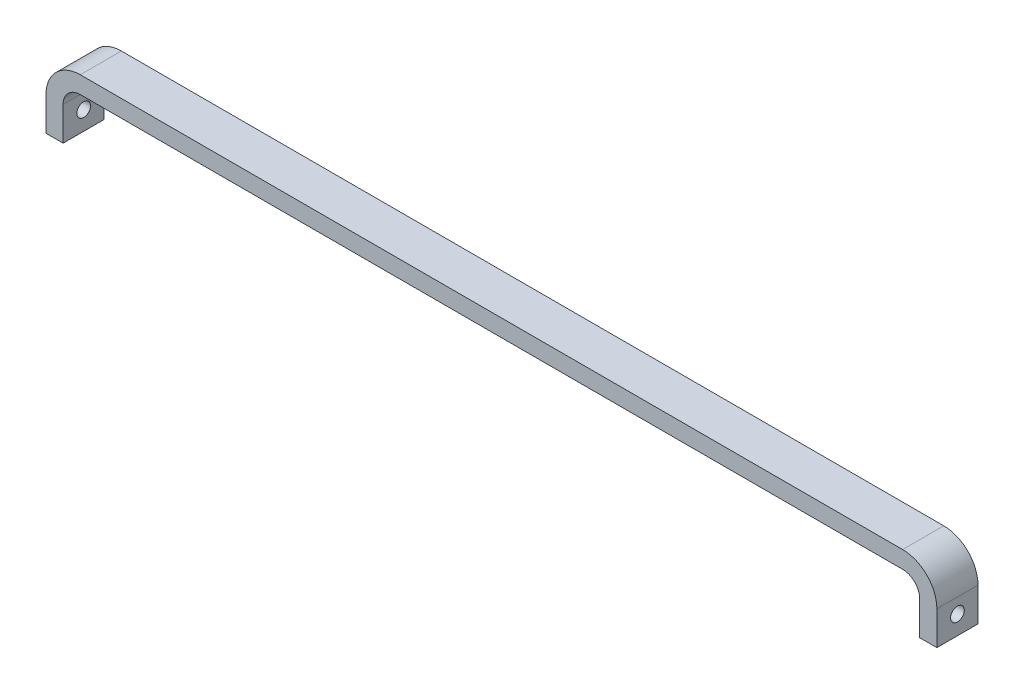
ISO-10303-21;
HEADER;
FILE_DESCRIPTION(('STEP AP214'),'2;1');
FILE_NAME('part.step','',(''),(''),'','','');
FILE_SCHEMA(('AUTOMOTIVE_DESIGN { 1 0 10303 214 1 1 1 1 }'));
ENDSEC;
DATA;
#1=APPLICATION_CONTEXT('core data for automotive mechanical design processes');
#2=APPLICATION_PROTOCOL_DEFINITION('international standard','automotive_design',2000,#1);
#3=PRODUCT_CONTEXT('',#1,'mechanical');
#4=PRODUCT('Part','Part','',(#3));
#5=PRODUCT_RELATED_PRODUCT_CATEGORY('part','',(#4));
#6=PRODUCT_DEFINITION_FORMATION('','',#4);
#7=PRODUCT_DEFINITION_CONTEXT('part definition',#1,'design');
#8=PRODUCT_DEFINITION('design','',#6,#7);
#9=PRODUCT_DEFINITION_SHAPE('','',#8);
#10=(LENGTH_UNIT() NAMED_UNIT(*) SI_UNIT(.MILLI.,.METRE.));
#11=(NAMED_UNIT(*) PLANE_ANGLE_UNIT() SI_UNIT($,.RADIAN.));
#12=(NAMED_UNIT(*) SI_UNIT($,.STERADIAN.) SOLID_ANGLE_UNIT());
#13=UNCERTAINTY_MEASURE_WITH_UNIT(LENGTH_MEASURE(1.E-05),#10,'distance_accuracy_value','');
#14=(GEOMETRIC_REPRESENTATION_CONTEXT(3) GLOBAL_UNCERTAINTY_ASSIGNED_CONTEXT((#13)) GLOBAL_UNIT_ASSIGNED_CONTEXT((#10,
#11,#12)) REPRESENTATION_CONTEXT('',''));
#15=CARTESIAN_POINT('',(0.,0.,0.));
#16=DIRECTION('',(0.,0.,1.));
#17=DIRECTION('',(1.,0.,0.));
#18=AXIS2_PLACEMENT_3D('',#15,#16,#17);
#19=CARTESIAN_POINT('',(0.,29.6,24.));
#20=DIRECTION('',(0.,1.,0.));
#21=DIRECTION('',(0.,0.,1.));
#22=AXIS2_PLACEMENT_3D('',#19,#20,#21);
#23=PLANE('',#22);
#24=DIRECTION('',(1.,0.,0.));
#25=VECTOR('',#24,1.);
#26=CARTESIAN_POINT('',(0.,29.6,0.));
#27=LINE('',#26,#25);
#28=CARTESIAN_POINT('',(20.,29.6,0.));
#29=VERTEX_POINT('',#28);
#30=CARTESIAN_POINT('',(500.,29.6,0.));
#31=VERTEX_POINT('',#30);
#32=EDGE_CURVE('E173',#29,#31,#27,.T.);
#33=ORIENTED_EDGE('',*,*,#32,.T.);
#34=DIRECTION('',(0.,0.,-1.));
#35=VECTOR('',#34,1.);
#36=CARTESIAN_POINT('',(500.,29.6,24.));
#37=LINE('',#36,#35);
#38=CARTESIAN_POINT('',(500.,29.6,24.));
#39=VERTEX_POINT('',#38);
#40=EDGE_CURVE('E11',#39,#31,#37,.T.);
#41=ORIENTED_EDGE('',*,*,#40,.F.);
#42=DIRECTION('',(1.,0.,0.));
#43=VECTOR('',#42,1.);
#44=CARTESIAN_POINT('',(0.,29.6,24.));
#45=LINE('',#44,#43);
#46=CARTESIAN_POINT('',(20.,29.6,24.));
#47=VERTEX_POINT('',#46);
#48=EDGE_CURVE('E215',#47,#39,#45,.T.);
#49=ORIENTED_EDGE('',*,*,#48,.F.);
#50=DIRECTION('',(0.,0.,-1.));
#51=VECTOR('',#50,1.);
#52=CARTESIAN_POINT('',(20.,29.6,24.));
#53=LINE('',#52,#51);
#54=EDGE_CURVE('E65',#47,#29,#53,.T.);
#55=ORIENTED_EDGE('',*,*,#54,.T.);
#56=EDGE_LOOP('',(#33,#41,#49,#55));
#57=FACE_BOUND('',#56,.T.);
#58=ADVANCED_FACE('F47',(#57),#23,.F.);
#59=CARTESIAN_POINT('',(500.,19.6,24.));
#60=DIRECTION('',(0.,0.,-1.));
#61=DIRECTION('',(-1.,0.,0.));
#62=AXIS2_PLACEMENT_3D('',#59,#60,#61);
#63=CYLINDRICAL_SURFACE('',#62,10.);
#64=CARTESIAN_POINT('',(500.,19.6,0.));
#65=DIRECTION('',(0.,0.,1.));
#66=DIRECTION('',(1.,0.,0.));
#67=AXIS2_PLACEMENT_3D('',#64,#65,#66);
#68=CIRCLE('',#67,10.);
#69=CARTESIAN_POINT('',(510.,19.6,0.));
#70=VERTEX_POINT('',#69);
#71=EDGE_CURVE('E176',#31,#70,#68,.F.);
#72=ORIENTED_EDGE('',*,*,#71,.T.);
#73=DIRECTION('',(0.,0.,-1.));
#74=VECTOR('',#73,1.);
#75=CARTESIAN_POINT('',(510.,19.6,24.));
#76=LINE('',#75,#74);
#77=CARTESIAN_POINT('',(510.,19.6,24.));
#78=VERTEX_POINT('',#77);
#79=EDGE_CURVE('E57',#78,#70,#76,.T.);
#80=ORIENTED_EDGE('',*,*,#79,.F.);
#81=CARTESIAN_POINT('',(500.,19.6,24.));
#82=DIRECTION('',(0.,0.,1.));
#83=DIRECTION('',(1.,0.,0.));
#84=AXIS2_PLACEMENT_3D('',#81,#82,#83);
#85=CIRCLE('',#84,10.);
#86=EDGE_CURVE('E115',#39,#78,#85,.F.);
#87=ORIENTED_EDGE('',*,*,#86,.F.);
#88=ORIENTED_EDGE('',*,*,#40,.T.);
#89=EDGE_LOOP('',(#72,#80,#87,#88));
#90=FACE_BOUND('',#89,.T.);
#91=ADVANCED_FACE('F300',(#90),#63,.F.);
#92=CARTESIAN_POINT('',(510.,0.,24.));
#93=DIRECTION('',(1.,0.,0.));
#94=DIRECTION('',(0.,0.,-1.));
#95=AXIS2_PLACEMENT_3D('',#92,#93,#94);
#96=PLANE('',#95);
#97=CARTESIAN_POINT('',(510.,11.,12.));
#98=DIRECTION('',(1.,0.,0.));
#99=DIRECTION('',(0.,0.,-1.));
#100=AXIS2_PLACEMENT_3D('',#97,#98,#99);
#101=CIRCLE('',#100,4.);
#102=CARTESIAN_POINT('',(510.,11.,8.));
#103=VERTEX_POINT('',#102);
#104=EDGE_CURVE('E177',#103,#103,#101,.T.);
#105=ORIENTED_EDGE('',*,*,#104,.T.);
#106=EDGE_LOOP('',(#105));
#107=FACE_BOUND('',#106,.T.);
#108=DIRECTION('',(0.,-1.,0.));
#109=VECTOR('',#108,1.);
#110=CARTESIAN_POINT('',(510.,0.,0.));
#111=LINE('',#110,#109);
#112=CARTESIAN_POINT('',(510.,0.,0.));
#113=VERTEX_POINT('',#112);
#114=EDGE_CURVE('E180',#70,#113,#111,.T.);
#115=ORIENTED_EDGE('',*,*,#114,.T.);
#116=DIRECTION('',(0.,0.,-1.));
#117=VECTOR('',#116,1.);
#118=CARTESIAN_POINT('',(510.,0.,24.));
#119=LINE('',#118,#117);
#120=CARTESIAN_POINT('',(510.,0.,24.));
#121=VERTEX_POINT('',#120);
#122=EDGE_CURVE('E238',#121,#113,#119,.T.);
#123=ORIENTED_EDGE('',*,*,#122,.F.);
#124=DIRECTION('',(0.,-1.,0.));
#125=VECTOR('',#124,1.);
#126=CARTESIAN_POINT('',(510.,0.,24.));
#127=LINE('',#126,#125);
#128=EDGE_CURVE('E249',#78,#121,#127,.T.);
#129=ORIENTED_EDGE('',*,*,#128,.F.);
#130=ORIENTED_EDGE('',*,*,#79,.T.);
#131=EDGE_LOOP('',(#115,#123,#129,#130));
#132=FACE_BOUND('',#131,.T.);
#133=ADVANCED_FACE('F247',(#107,#132),#96,.F.);
#134=CARTESIAN_POINT('',(0.,0.,24.));
#135=DIRECTION('',(0.,1.,0.));
#136=DIRECTION('',(0.,0.,1.));
#137=AXIS2_PLACEMENT_3D('',#134,#135,#136);
#138=PLANE('',#137);
#139=DIRECTION('',(1.,0.,0.));
#140=VECTOR('',#139,1.);
#141=CARTESIAN_POINT('',(0.,0.,0.));
#142=LINE('',#141,#140);
#143=CARTESIAN_POINT('',(520.,0.,0.));
#144=VERTEX_POINT('',#143);
#145=EDGE_CURVE('E183',#113,#144,#142,.T.);
#146=ORIENTED_EDGE('',*,*,#145,.T.);
#147=DIRECTION('',(0.,0.,-1.));
#148=VECTOR('',#147,1.);
#149=CARTESIAN_POINT('',(520.,0.,24.));
#150=LINE('',#149,#148);
#151=CARTESIAN_POINT('',(520.,0.,24.));
#152=VERTEX_POINT('',#151);
#153=EDGE_CURVE('E234',#152,#144,#150,.T.);
#154=ORIENTED_EDGE('',*,*,#153,.F.);
#155=DIRECTION('',(1.,0.,0.));
#156=VECTOR('',#155,1.);
#157=CARTESIAN_POINT('',(0.,0.,24.));
#158=LINE('',#157,#156);
#159=EDGE_CURVE('E267',#121,#152,#158,.T.);
#160=ORIENTED_EDGE('',*,*,#159,.F.);
#161=ORIENTED_EDGE('',*,*,#122,.T.);
#162=EDGE_LOOP('',(#146,#154,#160,#161));
#163=FACE_BOUND('',#162,.T.);
#164=ADVANCED_FACE('F256',(#163),#138,.F.);
#165=CARTESIAN_POINT('',(520.,0.,24.));
#166=DIRECTION('',(-1.,0.,0.));
#167=DIRECTION('',(0.,0.,1.));
#168=AXIS2_PLACEMENT_3D('',#165,#166,#167);
#169=PLANE('',#168);
#170=CARTESIAN_POINT('',(520.,11.,12.));
#171=DIRECTION('',(-1.,0.,0.));
#172=DIRECTION('',(0.,0.,1.));
#173=AXIS2_PLACEMENT_3D('',#170,#171,#172);
#174=CIRCLE('',#173,4.);
#175=CARTESIAN_POINT('',(520.,11.,16.));
#176=VERTEX_POINT('',#175);
#177=EDGE_CURVE('E318',#176,#176,#174,.T.);
#178=ORIENTED_EDGE('',*,*,#177,.T.);
#179=EDGE_LOOP('',(#178));
#180=FACE_BOUND('',#179,.T.);
#181=DIRECTION('',(0.,1.,0.));
#182=VECTOR('',#181,1.);
#183=CARTESIAN_POINT('',(520.,0.,0.));
#184=LINE('',#183,#182);
#185=CARTESIAN_POINT('',(520.,19.6,0.));
#186=VERTEX_POINT('',#185);
#187=EDGE_CURVE('E186',#144,#186,#184,.T.);
#188=ORIENTED_EDGE('',*,*,#187,.T.);
#189=DIRECTION('',(0.,0.,-1.));
#190=VECTOR('',#189,1.);
#191=CARTESIAN_POINT('',(520.,19.6,24.));
#192=LINE('',#191,#190);
#193=CARTESIAN_POINT('',(520.,19.6,24.));
#194=VERTEX_POINT('',#193);
#195=EDGE_CURVE('E231',#194,#186,#192,.T.);
#196=ORIENTED_EDGE('',*,*,#195,.F.);
#197=DIRECTION('',(0.,1.,0.));
#198=VECTOR('',#197,1.);
#199=CARTESIAN_POINT('',(520.,0.,24.));
#200=LINE('',#199,#198);
#201=EDGE_CURVE('E262',#152,#194,#200,.T.);
#202=ORIENTED_EDGE('',*,*,#201,.F.);
#203=ORIENTED_EDGE('',*,*,#153,.T.);
#204=EDGE_LOOP('',(#188,#196,#202,#203));
#205=FACE_BOUND('',#204,.T.);
#206=ADVANCED_FACE('F260',(#180,#205),#169,.F.);
#207=CARTESIAN_POINT('',(500.,19.6,24.));
#208=DIRECTION('',(0.,0.,-1.));
#209=DIRECTION('',(-1.,0.,0.));
#210=AXIS2_PLACEMENT_3D('',#207,#208,#209);
#211=CYLINDRICAL_SURFACE('',#210,20.);
#212=CARTESIAN_POINT('',(500.,19.6,0.));
#213=DIRECTION('',(0.,0.,1.));
#214=DIRECTION('',(1.,0.,0.));
#215=AXIS2_PLACEMENT_3D('',#212,#213,#214);
#216=CIRCLE('',#215,20.);
#217=CARTESIAN_POINT('',(500.,39.6,0.));
#218=VERTEX_POINT('',#217);
#219=EDGE_CURVE('E190',#218,#186,#216,.F.);
#220=ORIENTED_EDGE('',*,*,#219,.F.);
#221=DIRECTION('',(0.,0.,-1.));
#222=VECTOR('',#221,1.);
#223=CARTESIAN_POINT('',(500.,39.6,24.));
#224=LINE('',#223,#222);
#225=CARTESIAN_POINT('',(500.,39.6,24.));
#226=VERTEX_POINT('',#225);
#227=EDGE_CURVE('E228',#226,#218,#224,.T.);
#228=ORIENTED_EDGE('',*,*,#227,.F.);
#229=CARTESIAN_POINT('',(500.,19.6,24.));
#230=DIRECTION('',(0.,0.,1.));
#231=DIRECTION('',(1.,0.,0.));
#232=AXIS2_PLACEMENT_3D('',#229,#230,#231);
#233=CIRCLE('',#232,20.);
#234=EDGE_CURVE('E266',#226,#194,#233,.F.);
#235=ORIENTED_EDGE('',*,*,#234,.T.);
#236=ORIENTED_EDGE('',*,*,#195,.T.);
#237=EDGE_LOOP('',(#220,#228,#235,#236));
#238=FACE_BOUND('',#237,.T.);
#239=ADVANCED_FACE('F348',(#238),#211,.T.);
#240=CARTESIAN_POINT('',(0.,39.6,24.));
#241=DIRECTION('',(0.,1.,0.));
#242=DIRECTION('',(0.,0.,1.));
#243=AXIS2_PLACEMENT_3D('',#240,#241,#242);
#244=PLANE('',#243);
#245=DIRECTION('',(1.,0.,0.));
#246=VECTOR('',#245,1.);
#247=CARTESIAN_POINT('',(0.,39.6,0.));
#248=LINE('',#247,#246);
#249=CARTESIAN_POINT('',(20.,39.6,0.));
#250=VERTEX_POINT('',#249);
#251=EDGE_CURVE('E194',#250,#218,#248,.T.);
#252=ORIENTED_EDGE('',*,*,#251,.F.);
#253=DIRECTION('',(0.,0.,-1.));
#254=VECTOR('',#253,1.);
#255=CARTESIAN_POINT('',(20.,39.6,24.));
#256=LINE('',#255,#254);
#257=CARTESIAN_POINT('',(20.,39.6,24.));
#258=VERTEX_POINT('',#257);
#259=EDGE_CURVE('E225',#258,#250,#256,.T.);
#260=ORIENTED_EDGE('',*,*,#259,.F.);
#261=DIRECTION('',(1.,0.,0.));
#262=VECTOR('',#261,1.);
#263=CARTESIAN_POINT('',(0.,39.6,24.));
#264=LINE('',#263,#262);
#265=EDGE_CURVE('E271',#258,#226,#264,.T.);
#266=ORIENTED_EDGE('',*,*,#265,.T.);
#267=ORIENTED_EDGE('',*,*,#227,.T.);
#268=EDGE_LOOP('',(#252,#260,#266,#267));
#269=FACE_BOUND('',#268,.T.);
#270=ADVANCED_FACE('F342',(#269),#244,.T.);
#271=CARTESIAN_POINT('',(20.,19.6,24.));
#272=DIRECTION('',(0.,0.,-1.));
#273=DIRECTION('',(-1.,0.,0.));
#274=AXIS2_PLACEMENT_3D('',#271,#272,#273);
#275=CYLINDRICAL_SURFACE('',#274,20.);
#276=CARTESIAN_POINT('',(20.,19.6,0.));
#277=DIRECTION('',(0.,0.,1.));
#278=DIRECTION('',(1.,0.,0.));
#279=AXIS2_PLACEMENT_3D('',#276,#277,#278);
#280=CIRCLE('',#279,20.);
#281=CARTESIAN_POINT('',(0.,19.6,0.));
#282=VERTEX_POINT('',#281);
#283=EDGE_CURVE('E198',#250,#282,#280,.T.);
#284=ORIENTED_EDGE('',*,*,#283,.T.);
#285=DIRECTION('',(0.,0.,-1.));
#286=VECTOR('',#285,1.);
#287=CARTESIAN_POINT('',(0.,19.6,24.));
#288=LINE('',#287,#286);
#289=CARTESIAN_POINT('',(0.,19.6,24.));
#290=VERTEX_POINT('',#289);
#291=EDGE_CURVE('E222',#290,#282,#288,.T.);
#292=ORIENTED_EDGE('',*,*,#291,.F.);
#293=CARTESIAN_POINT('',(20.,19.6,24.));
#294=DIRECTION('',(0.,0.,1.));
#295=DIRECTION('',(1.,0.,0.));
#296=AXIS2_PLACEMENT_3D('',#293,#294,#295);
#297=CIRCLE('',#296,20.);
#298=EDGE_CURVE('E279',#258,#290,#297,.T.);
#299=ORIENTED_EDGE('',*,*,#298,.F.);
#300=ORIENTED_EDGE('',*,*,#259,.T.);
#301=EDGE_LOOP('',(#284,#292,#299,#300));
#302=FACE_BOUND('',#301,.T.);
#303=ADVANCED_FACE('F335',(#302),#275,.T.);
#304=CARTESIAN_POINT('',(0.,0.,24.));
#305=DIRECTION('',(-1.,0.,0.));
#306=DIRECTION('',(0.,0.,1.));
#307=AXIS2_PLACEMENT_3D('',#304,#305,#306);
#308=PLANE('',#307);
#309=CARTESIAN_POINT('',(0.,11.,12.));
#310=DIRECTION('',(-1.,0.,0.));
#311=DIRECTION('',(0.,0.,1.));
#312=AXIS2_PLACEMENT_3D('',#309,#310,#311);
#313=CIRCLE('',#312,4.);
#314=CARTESIAN_POINT('',(0.,11.,16.));
#315=VERTEX_POINT('',#314);
#316=EDGE_CURVE('E314',#315,#315,#313,.T.);
#317=ORIENTED_EDGE('',*,*,#316,.F.);
#318=EDGE_LOOP('',(#317));
#319=FACE_BOUND('',#318,.T.);
#320=DIRECTION('',(0.,1.,0.));
#321=VECTOR('',#320,1.);
#322=CARTESIAN_POINT('',(0.,0.,0.));
#323=LINE('',#322,#321);
#324=CARTESIAN_POINT('',(0.,0.,0.));
#325=VERTEX_POINT('',#324);
#326=EDGE_CURVE('E202',#325,#282,#323,.T.);
#327=ORIENTED_EDGE('',*,*,#326,.F.);
#328=DIRECTION('',(0.,0.,-1.));
#329=VECTOR('',#328,1.);
#330=CARTESIAN_POINT('',(0.,0.,24.));
#331=LINE('',#330,#329);
#332=CARTESIAN_POINT('',(0.,0.,24.));
#333=VERTEX_POINT('',#332);
#334=EDGE_CURVE('E163',#333,#325,#331,.T.);
#335=ORIENTED_EDGE('',*,*,#334,.F.);
#336=DIRECTION('',(0.,1.,0.));
#337=VECTOR('',#336,1.);
#338=CARTESIAN_POINT('',(0.,0.,24.));
#339=LINE('',#338,#337);
#340=EDGE_CURVE('E151',#333,#290,#339,.T.);
#341=ORIENTED_EDGE('',*,*,#340,.T.);
#342=ORIENTED_EDGE('',*,*,#291,.T.);
#343=EDGE_LOOP('',(#327,#335,#341,#342));
#344=FACE_BOUND('',#343,.T.);
#345=ADVANCED_FACE('F284',(#319,#344),#308,.T.);
#346=CARTESIAN_POINT('',(0.,0.,24.));
#347=DIRECTION('',(0.,1.,0.));
#348=DIRECTION('',(0.,0.,1.));
#349=AXIS2_PLACEMENT_3D('',#346,#347,#348);
#350=PLANE('',#349);
#351=DIRECTION('',(1.,0.,0.));
#352=VECTOR('',#351,1.);
#353=CARTESIAN_POINT('',(0.,0.,0.));
#354=LINE('',#353,#352);
#355=CARTESIAN_POINT('',(10.,0.,0.));
#356=VERTEX_POINT('',#355);
#357=EDGE_CURVE('E159',#325,#356,#354,.T.);
#358=ORIENTED_EDGE('',*,*,#357,.T.);
#359=DIRECTION('',(0.,0.,-1.));
#360=VECTOR('',#359,1.);
#361=CARTESIAN_POINT('',(10.,0.,24.));
#362=LINE('',#361,#360);
#363=CARTESIAN_POINT('',(10.,0.,24.));
#364=VERTEX_POINT('',#363);
#365=EDGE_CURVE('E156',#364,#356,#362,.T.);
#366=ORIENTED_EDGE('',*,*,#365,.F.);
#367=DIRECTION('',(1.,0.,0.));
#368=VECTOR('',#367,1.);
#369=CARTESIAN_POINT('',(0.,0.,24.));
#370=LINE('',#369,#368);
#371=EDGE_CURVE('E144',#333,#364,#370,.T.);
#372=ORIENTED_EDGE('',*,*,#371,.F.);
#373=ORIENTED_EDGE('',*,*,#334,.T.);
#374=EDGE_LOOP('',(#358,#366,#372,#373));
#375=FACE_BOUND('',#374,.T.);
#376=ADVANCED_FACE('F157',(#375),#350,.F.);
#377=CARTESIAN_POINT('',(10.,0.,24.));
#378=DIRECTION('',(1.,0.,0.));
#379=DIRECTION('',(0.,0.,-1.));
#380=AXIS2_PLACEMENT_3D('',#377,#378,#379);
#381=PLANE('',#380);
#382=CARTESIAN_POINT('',(10.,11.,12.));
#383=DIRECTION('',(1.,0.,0.));
#384=DIRECTION('',(0.,0.,-1.));
#385=AXIS2_PLACEMENT_3D('',#382,#383,#384);
#386=CIRCLE('',#385,4.);
#387=CARTESIAN_POINT('',(10.,11.,8.));
#388=VERTEX_POINT('',#387);
#389=EDGE_CURVE('E50',#388,#388,#386,.T.);
#390=ORIENTED_EDGE('',*,*,#389,.F.);
#391=EDGE_LOOP('',(#390));
#392=FACE_BOUND('',#391,.T.);
#393=DIRECTION('',(0.,-1.,0.));
#394=VECTOR('',#393,1.);
#395=CARTESIAN_POINT('',(10.,0.,0.));
#396=LINE('',#395,#394);
#397=CARTESIAN_POINT('',(10.,19.6,0.));
#398=VERTEX_POINT('',#397);
#399=EDGE_CURVE('E208',#398,#356,#396,.T.);
#400=ORIENTED_EDGE('',*,*,#399,.F.);
#401=DIRECTION('',(0.,0.,-1.));
#402=VECTOR('',#401,1.);
#403=CARTESIAN_POINT('',(10.,19.6,24.));
#404=LINE('',#403,#402);
#405=CARTESIAN_POINT('',(10.,19.6,24.));
#406=VERTEX_POINT('',#405);
#407=EDGE_CURVE('E103',#406,#398,#404,.T.);
#408=ORIENTED_EDGE('',*,*,#407,.F.);
#409=DIRECTION('',(0.,-1.,0.));
#410=VECTOR('',#409,1.);
#411=CARTESIAN_POINT('',(10.,0.,24.));
#412=LINE('',#411,#410);
#413=EDGE_CURVE('E149',#406,#364,#412,.T.);
#414=ORIENTED_EDGE('',*,*,#413,.T.);
#415=ORIENTED_EDGE('',*,*,#365,.T.);
#416=EDGE_LOOP('',(#400,#408,#414,#415));
#417=FACE_BOUND('',#416,.T.);
#418=ADVANCED_FACE('F165',(#392,#417),#381,.T.);
#419=CARTESIAN_POINT('',(20.,19.6,24.));
#420=DIRECTION('',(0.,0.,-1.));
#421=DIRECTION('',(-1.,0.,0.));
#422=AXIS2_PLACEMENT_3D('',#419,#420,#421);
#423=CYLINDRICAL_SURFACE('',#422,10.);
#424=CARTESIAN_POINT('',(20.,19.6,0.));
#425=DIRECTION('',(0.,0.,1.));
#426=DIRECTION('',(1.,0.,0.));
#427=AXIS2_PLACEMENT_3D('',#424,#425,#426);
#428=CIRCLE('',#427,10.);
#429=EDGE_CURVE('E211',#29,#398,#428,.T.);
#430=ORIENTED_EDGE('',*,*,#429,.F.);
#431=ORIENTED_EDGE('',*,*,#54,.F.);
#432=CARTESIAN_POINT('',(20.,19.6,24.));
#433=DIRECTION('',(0.,0.,1.));
#434=DIRECTION('',(1.,0.,0.));
#435=AXIS2_PLACEMENT_3D('',#432,#433,#434);
#436=CIRCLE('',#435,10.);
#437=EDGE_CURVE('E167',#47,#406,#436,.T.);
#438=ORIENTED_EDGE('',*,*,#437,.T.);
#439=ORIENTED_EDGE('',*,*,#407,.T.);
#440=EDGE_LOOP('',(#430,#431,#438,#439));
#441=FACE_BOUND('',#440,.T.);
#442=ADVANCED_FACE('F287',(#441),#423,.F.);
#443=CARTESIAN_POINT('',(0.,0.,24.));
#444=DIRECTION('',(0.,0.,1.));
#445=DIRECTION('',(1.,0.,0.));
#446=AXIS2_PLACEMENT_3D('',#443,#444,#445);
#447=PLANE('',#446);
#448=ORIENTED_EDGE('',*,*,#48,.T.);
#449=ORIENTED_EDGE('',*,*,#86,.T.);
#450=ORIENTED_EDGE('',*,*,#128,.T.);
#451=ORIENTED_EDGE('',*,*,#159,.T.);
#452=ORIENTED_EDGE('',*,*,#201,.T.);
#453=ORIENTED_EDGE('',*,*,#234,.F.);
#454=ORIENTED_EDGE('',*,*,#265,.F.);
#455=ORIENTED_EDGE('',*,*,#298,.T.);
#456=ORIENTED_EDGE('',*,*,#340,.F.);
#457=ORIENTED_EDGE('',*,*,#371,.T.);
#458=ORIENTED_EDGE('',*,*,#413,.F.);
#459=ORIENTED_EDGE('',*,*,#437,.F.);
#460=EDGE_LOOP('',(#448,#449,#450,#451,#452,#453,#454,#455,#456,#457,#458,#459));
#461=FACE_BOUND('',#460,.T.);
#462=ADVANCED_FACE('F146',(#461),#447,.T.);
#463=CARTESIAN_POINT('',(0.,0.,0.));
#464=DIRECTION('',(0.,0.,1.));
#465=DIRECTION('',(1.,0.,0.));
#466=AXIS2_PLACEMENT_3D('',#463,#464,#465);
#467=PLANE('',#466);
#468=ORIENTED_EDGE('',*,*,#32,.F.);
#469=ORIENTED_EDGE('',*,*,#429,.T.);
#470=ORIENTED_EDGE('',*,*,#399,.T.);
#471=ORIENTED_EDGE('',*,*,#357,.F.);
#472=ORIENTED_EDGE('',*,*,#326,.T.);
#473=ORIENTED_EDGE('',*,*,#283,.F.);
#474=ORIENTED_EDGE('',*,*,#251,.T.);
#475=ORIENTED_EDGE('',*,*,#219,.T.);
#476=ORIENTED_EDGE('',*,*,#187,.F.);
#477=ORIENTED_EDGE('',*,*,#145,.F.);
#478=ORIENTED_EDGE('',*,*,#114,.F.);
#479=ORIENTED_EDGE('',*,*,#71,.F.);
#480=EDGE_LOOP('',(#468,#469,#470,#471,#472,#473,#474,#475,#476,#477,#478,#479));
#481=FACE_BOUND('',#480,.T.);
#482=ADVANCED_FACE('F252',(#481),#467,.F.);
#483=CARTESIAN_POINT('',(520.,11.,12.));
#484=DIRECTION('',(-1.,0.,0.));
#485=DIRECTION('',(0.,0.,1.));
#486=AXIS2_PLACEMENT_3D('',#483,#484,#485);
#487=CYLINDRICAL_SURFACE('',#486,4.);
#488=ORIENTED_EDGE('',*,*,#389,.T.);
#489=EDGE_LOOP('',(#488));
#490=FACE_BOUND('',#489,.T.);
#491=ORIENTED_EDGE('',*,*,#316,.T.);
#492=EDGE_LOOP('',(#491));
#493=FACE_BOUND('',#492,.T.);
#494=ADVANCED_FACE('F327',(#490,#493),#487,.F.);
#495=ORIENTED_EDGE('',*,*,#177,.F.);
#496=EDGE_LOOP('',(#495));
#497=FACE_BOUND('',#496,.T.);
#498=ORIENTED_EDGE('',*,*,#104,.F.);
#499=EDGE_LOOP('',(#498));
#500=FACE_BOUND('',#499,.T.);
#501=ADVANCED_FACE('F330',(#497,#500),#487,.F.);
#502=CLOSED_SHELL('',(#58,#91,#133,#164,#206,#239,#270,#303,#345,#376,#418,#442,#462,#482,#494,#501));
#503=MANIFOLD_SOLID_BREP('B2',#502);
#504=ADVANCED_BREP_SHAPE_REPRESENTATION('',(#18,#503),#14);
#505=SHAPE_DEFINITION_REPRESENTATION(#9,#504);
ENDSEC;
END-ISO-10303-21;
